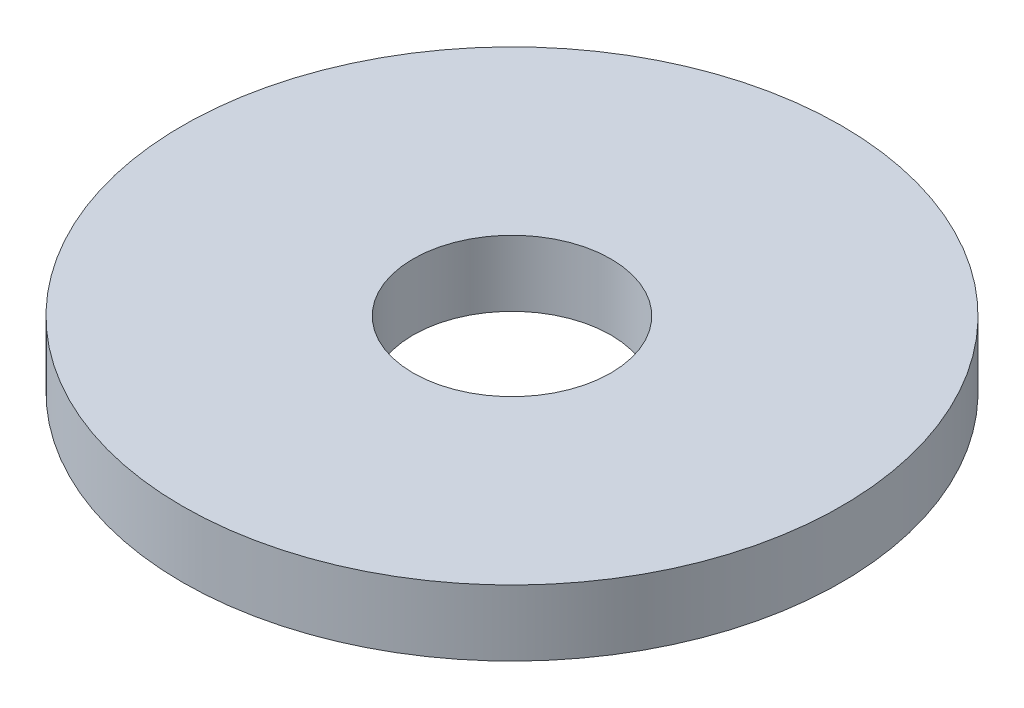
ISO-10303-21;
HEADER;
FILE_DESCRIPTION(('STEP AP214'),'2;1');
FILE_NAME('part.step','',(''),(''),'','','');
FILE_SCHEMA(('AUTOMOTIVE_DESIGN { 1 0 10303 214 1 1 1 1 }'));
ENDSEC;
DATA;
#1=APPLICATION_CONTEXT('core data for automotive mechanical design processes');
#2=APPLICATION_PROTOCOL_DEFINITION('international standard','automotive_design',2000,#1);
#3=PRODUCT_CONTEXT('',#1,'mechanical');
#4=PRODUCT('Part','Part','',(#3));
#5=PRODUCT_RELATED_PRODUCT_CATEGORY('part','',(#4));
#6=PRODUCT_DEFINITION_FORMATION('','',#4);
#7=PRODUCT_DEFINITION_CONTEXT('part definition',#1,'design');
#8=PRODUCT_DEFINITION('design','',#6,#7);
#9=PRODUCT_DEFINITION_SHAPE('','',#8);
#10=(LENGTH_UNIT() NAMED_UNIT(*) SI_UNIT(.MILLI.,.METRE.));
#11=(NAMED_UNIT(*) PLANE_ANGLE_UNIT() SI_UNIT($,.RADIAN.));
#12=(NAMED_UNIT(*) SI_UNIT($,.STERADIAN.) SOLID_ANGLE_UNIT());
#13=UNCERTAINTY_MEASURE_WITH_UNIT(LENGTH_MEASURE(1.E-05),#10,'distance_accuracy_value','');
#14=(GEOMETRIC_REPRESENTATION_CONTEXT(3) GLOBAL_UNCERTAINTY_ASSIGNED_CONTEXT((#13)) GLOBAL_UNIT_ASSIGNED_CONTEXT((#10,
#11,#12)) REPRESENTATION_CONTEXT('',''));
#15=CARTESIAN_POINT('',(0.,0.,0.));
#16=DIRECTION('',(0.,0.,1.));
#17=DIRECTION('',(1.,0.,0.));
#18=AXIS2_PLACEMENT_3D('',#15,#16,#17);
#19=CARTESIAN_POINT('',(12.8686463229554,1.,5.));
#20=DIRECTION('',(0.,1.,0.));
#21=DIRECTION('',(0.,0.,1.));
#22=AXIS2_PLACEMENT_3D('',#19,#20,#21);
#23=PLANE('',#22);
#24=CARTESIAN_POINT('',(12.8686463229554,1.,5.));
#25=DIRECTION('',(0.,1.,0.));
#26=DIRECTION('',(0.,0.,1.));
#27=AXIS2_PLACEMENT_3D('',#24,#25,#26);
#28=CIRCLE('',#27,5.);
#29=CARTESIAN_POINT('',(12.8686463229554,1.,10.));
#30=VERTEX_POINT('',#29);
#31=EDGE_CURVE('E10',#30,#30,#28,.T.);
#32=ORIENTED_EDGE('',*,*,#31,.T.);
#33=EDGE_LOOP('',(#32));
#34=FACE_BOUND('',#33,.T.);
#35=CARTESIAN_POINT('',(12.8686463229554,1.,5.));
#36=DIRECTION('',(0.,1.,0.));
#37=DIRECTION('',(0.,0.,1.));
#38=AXIS2_PLACEMENT_3D('',#35,#36,#37);
#39=CIRCLE('',#38,1.5);
#40=CARTESIAN_POINT('',(12.8686463229554,1.,6.5));
#41=VERTEX_POINT('',#40);
#42=EDGE_CURVE('E42',#41,#41,#39,.T.);
#43=ORIENTED_EDGE('',*,*,#42,.F.);
#44=EDGE_LOOP('',(#43));
#45=FACE_BOUND('',#44,.T.);
#46=ADVANCED_FACE('F31',(#34,#45),#23,.T.);
#47=CARTESIAN_POINT('',(12.8686463229554,0.,5.));
#48=DIRECTION('',(0.,1.,0.));
#49=DIRECTION('',(0.,0.,1.));
#50=AXIS2_PLACEMENT_3D('',#47,#48,#49);
#51=PLANE('',#50);
#52=CARTESIAN_POINT('',(12.8686463229554,0.,5.));
#53=DIRECTION('',(0.,1.,0.));
#54=DIRECTION('',(0.,0.,1.));
#55=AXIS2_PLACEMENT_3D('',#52,#53,#54);
#56=CIRCLE('',#55,5.);
#57=CARTESIAN_POINT('',(12.8686463229554,0.,10.));
#58=VERTEX_POINT('',#57);
#59=EDGE_CURVE('E35',#58,#58,#56,.T.);
#60=ORIENTED_EDGE('',*,*,#59,.F.);
#61=EDGE_LOOP('',(#60));
#62=FACE_BOUND('',#61,.T.);
#63=CARTESIAN_POINT('',(12.8686463229554,0.,5.));
#64=DIRECTION('',(0.,1.,0.));
#65=DIRECTION('',(0.,0.,1.));
#66=AXIS2_PLACEMENT_3D('',#63,#64,#65);
#67=CIRCLE('',#66,1.5);
#68=CARTESIAN_POINT('',(12.8686463229554,0.,6.5));
#69=VERTEX_POINT('',#68);
#70=EDGE_CURVE('E44',#69,#69,#67,.T.);
#71=ORIENTED_EDGE('',*,*,#70,.T.);
#72=EDGE_LOOP('',(#71));
#73=FACE_BOUND('',#72,.T.);
#74=ADVANCED_FACE('F54',(#62,#73),#51,.F.);
#75=CARTESIAN_POINT('',(12.8686463229554,1.,5.));
#76=DIRECTION('',(0.,-1.,0.));
#77=DIRECTION('',(0.,0.,-1.));
#78=AXIS2_PLACEMENT_3D('',#75,#76,#77);
#79=CYLINDRICAL_SURFACE('',#78,5.);
#80=ORIENTED_EDGE('',*,*,#31,.F.);
#81=EDGE_LOOP('',(#80));
#82=FACE_BOUND('',#81,.T.);
#83=ORIENTED_EDGE('',*,*,#59,.T.);
#84=EDGE_LOOP('',(#83));
#85=FACE_BOUND('',#84,.T.);
#86=ADVANCED_FACE('F33',(#82,#85),#79,.T.);
#87=CARTESIAN_POINT('',(12.8686463229554,1.,5.));
#88=DIRECTION('',(0.,-1.,0.));
#89=DIRECTION('',(0.,0.,-1.));
#90=AXIS2_PLACEMENT_3D('',#87,#88,#89);
#91=CYLINDRICAL_SURFACE('',#90,1.5);
#92=ORIENTED_EDGE('',*,*,#42,.T.);
#93=EDGE_LOOP('',(#92));
#94=FACE_BOUND('',#93,.T.);
#95=ORIENTED_EDGE('',*,*,#70,.F.);
#96=EDGE_LOOP('',(#95));
#97=FACE_BOUND('',#96,.T.);
#98=ADVANCED_FACE('F50',(#94,#97),#91,.F.);
#99=CLOSED_SHELL('',(#46,#74,#86,#98));
#100=MANIFOLD_SOLID_BREP('B2',#99);
#101=ADVANCED_BREP_SHAPE_REPRESENTATION('',(#18,#100),#14);
#102=SHAPE_DEFINITION_REPRESENTATION(#9,#101);
ENDSEC;
END-ISO-10303-21;
